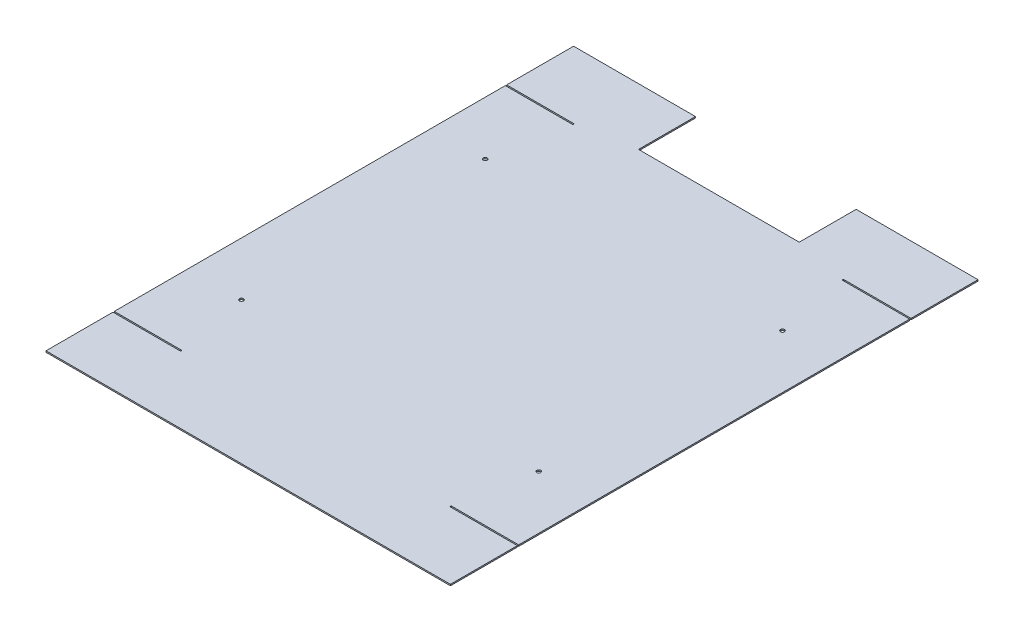
ISO-10303-21;
HEADER;
FILE_DESCRIPTION(('STEP AP214'),'2;1');
FILE_NAME('part.step','',(''),(''),'','','');
FILE_SCHEMA(('AUTOMOTIVE_DESIGN { 1 0 10303 214 1 1 1 1 }'));
ENDSEC;
DATA;
#1=APPLICATION_CONTEXT('core data for automotive mechanical design processes');
#2=APPLICATION_PROTOCOL_DEFINITION('international standard','automotive_design',2000,#1);
#3=PRODUCT_CONTEXT('',#1,'mechanical');
#4=PRODUCT('Part','Part','',(#3));
#5=PRODUCT_RELATED_PRODUCT_CATEGORY('part','',(#4));
#6=PRODUCT_DEFINITION_FORMATION('','',#4);
#7=PRODUCT_DEFINITION_CONTEXT('part definition',#1,'design');
#8=PRODUCT_DEFINITION('design','',#6,#7);
#9=PRODUCT_DEFINITION_SHAPE('','',#8);
#10=(LENGTH_UNIT() NAMED_UNIT(*) SI_UNIT(.MILLI.,.METRE.));
#11=(NAMED_UNIT(*) PLANE_ANGLE_UNIT() SI_UNIT($,.RADIAN.));
#12=(NAMED_UNIT(*) SI_UNIT($,.STERADIAN.) SOLID_ANGLE_UNIT());
#13=UNCERTAINTY_MEASURE_WITH_UNIT(LENGTH_MEASURE(1.E-05),#10,'distance_accuracy_value','');
#14=(GEOMETRIC_REPRESENTATION_CONTEXT(3) GLOBAL_UNCERTAINTY_ASSIGNED_CONTEXT((#13)) GLOBAL_UNIT_ASSIGNED_CONTEXT((#10,
#11,#12)) REPRESENTATION_CONTEXT('',''));
#15=CARTESIAN_POINT('',(0.,0.,0.));
#16=DIRECTION('',(0.,0.,1.));
#17=DIRECTION('',(1.,0.,0.));
#18=AXIS2_PLACEMENT_3D('',#15,#16,#17);
#19=CARTESIAN_POINT('',(-151.,1.,-197.));
#20=DIRECTION('',(0.,0.,1.));
#21=DIRECTION('',(1.,0.,0.));
#22=AXIS2_PLACEMENT_3D('',#19,#20,#21);
#23=PLANE('',#22);
#24=DIRECTION('',(-1.,0.,0.));
#25=VECTOR('',#24,1.);
#26=CARTESIAN_POINT('',(-151.,0.,-197.));
#27=LINE('',#26,#25);
#28=CARTESIAN_POINT('',(151.,0.,-197.));
#29=VERTEX_POINT('',#28);
#30=CARTESIAN_POINT('',(60.,0.,-197.));
#31=VERTEX_POINT('',#30);
#32=EDGE_CURVE('E213',#29,#31,#27,.T.);
#33=ORIENTED_EDGE('',*,*,#32,.T.);
#34=DIRECTION('',(0.,1.,0.));
#35=VECTOR('',#34,1.);
#36=CARTESIAN_POINT('',(60.,0.,-197.));
#37=LINE('',#36,#35);
#38=CARTESIAN_POINT('',(60.,1.,-197.));
#39=VERTEX_POINT('',#38);
#40=EDGE_CURVE('E195',#31,#39,#37,.T.);
#41=ORIENTED_EDGE('',*,*,#40,.T.);
#42=DIRECTION('',(-1.,0.,0.));
#43=VECTOR('',#42,1.);
#44=CARTESIAN_POINT('',(-151.,1.,-197.));
#45=LINE('',#44,#43);
#46=CARTESIAN_POINT('',(151.,1.,-197.));
#47=VERTEX_POINT('',#46);
#48=EDGE_CURVE('E285',#47,#39,#45,.T.);
#49=ORIENTED_EDGE('',*,*,#48,.F.);
#50=DIRECTION('',(0.,-1.,0.));
#51=VECTOR('',#50,1.);
#52=CARTESIAN_POINT('',(151.,1.,-197.));
#53=LINE('',#52,#51);
#54=EDGE_CURVE('E11',#47,#29,#53,.T.);
#55=ORIENTED_EDGE('',*,*,#54,.T.);
#56=EDGE_LOOP('',(#33,#41,#49,#55));
#57=FACE_BOUND('',#56,.T.);
#58=ADVANCED_FACE('F33',(#57),#23,.F.);
#59=CARTESIAN_POINT('',(0.,1.,0.));
#60=DIRECTION('',(0.,1.,0.));
#61=DIRECTION('',(0.,0.,1.));
#62=AXIS2_PLACEMENT_3D('',#59,#60,#61);
#63=PLANE('',#62);
#64=DIRECTION('',(0.,0.,-1.));
#65=VECTOR('',#64,1.);
#66=CARTESIAN_POINT('',(60.,1.,-154.5));
#67=LINE('',#66,#65);
#68=CARTESIAN_POINT('',(60.,1.,-154.5));
#69=VERTEX_POINT('',#68);
#70=EDGE_CURVE('E201',#69,#39,#67,.T.);
#71=ORIENTED_EDGE('',*,*,#70,.F.);
#72=DIRECTION('',(1.,0.,0.));
#73=VECTOR('',#72,1.);
#74=CARTESIAN_POINT('',(-60.,1.,-154.5));
#75=LINE('',#74,#73);
#76=CARTESIAN_POINT('',(-60.,1.,-154.5));
#77=VERTEX_POINT('',#76);
#78=EDGE_CURVE('E215',#77,#69,#75,.T.);
#79=ORIENTED_EDGE('',*,*,#78,.F.);
#80=DIRECTION('',(0.,0.,1.));
#81=VECTOR('',#80,1.);
#82=CARTESIAN_POINT('',(-60.,1.,-154.5));
#83=LINE('',#82,#81);
#84=CARTESIAN_POINT('',(-60.,1.,-197.));
#85=VERTEX_POINT('',#84);
#86=EDGE_CURVE('E365',#85,#77,#83,.T.);
#87=ORIENTED_EDGE('',*,*,#86,.F.);
#88=CARTESIAN_POINT('',(-151.,1.,-197.));
#89=VERTEX_POINT('',#88);
#90=EDGE_CURVE('E283',#85,#89,#45,.T.);
#91=ORIENTED_EDGE('',*,*,#90,.T.);
#92=DIRECTION('',(0.,0.,1.));
#93=VECTOR('',#92,1.);
#94=CARTESIAN_POINT('',(-151.,1.,-197.));
#95=LINE('',#94,#93);
#96=CARTESIAN_POINT('',(-151.,1.,-147.));
#97=VERTEX_POINT('',#96);
#98=EDGE_CURVE('E246',#89,#97,#95,.T.);
#99=ORIENTED_EDGE('',*,*,#98,.T.);
#100=DIRECTION('',(-1.,0.,0.));
#101=VECTOR('',#100,1.);
#102=CARTESIAN_POINT('',(-151.,1.,-147.));
#103=LINE('',#102,#101);
#104=CARTESIAN_POINT('',(-101.,1.,-147.));
#105=VERTEX_POINT('',#104);
#106=EDGE_CURVE('E272',#105,#97,#103,.T.);
#107=ORIENTED_EDGE('',*,*,#106,.F.);
#108=CARTESIAN_POINT('',(-101.,1.,-146.5));
#109=DIRECTION('',(0.,1.,0.));
#110=DIRECTION('',(0.,0.,1.));
#111=AXIS2_PLACEMENT_3D('',#108,#109,#110);
#112=CIRCLE('',#111,0.499999999999973);
#113=CARTESIAN_POINT('',(-101.,1.,-146.));
#114=VERTEX_POINT('',#113);
#115=EDGE_CURVE('E268',#114,#105,#112,.T.);
#116=ORIENTED_EDGE('',*,*,#115,.F.);
#117=DIRECTION('',(1.,0.,0.));
#118=VECTOR('',#117,1.);
#119=CARTESIAN_POINT('',(-151.,1.,-146.));
#120=LINE('',#119,#118);
#121=CARTESIAN_POINT('',(-151.,1.,-146.));
#122=VERTEX_POINT('',#121);
#123=EDGE_CURVE('E265',#122,#114,#120,.T.);
#124=ORIENTED_EDGE('',*,*,#123,.F.);
#125=CARTESIAN_POINT('',(-151.,1.,146.));
#126=VERTEX_POINT('',#125);
#127=EDGE_CURVE('E288',#122,#126,#95,.T.);
#128=ORIENTED_EDGE('',*,*,#127,.T.);
#129=DIRECTION('',(1.,0.,0.));
#130=VECTOR('',#129,1.);
#131=CARTESIAN_POINT('',(-151.,1.,146.));
#132=LINE('',#131,#130);
#133=CARTESIAN_POINT('',(-101.,1.,146.));
#134=VERTEX_POINT('',#133);
#135=EDGE_CURVE('E329',#126,#134,#132,.T.);
#136=ORIENTED_EDGE('',*,*,#135,.T.);
#137=CARTESIAN_POINT('',(-101.,1.,146.5));
#138=DIRECTION('',(0.,-1.,0.));
#139=DIRECTION('',(0.,0.,-1.));
#140=AXIS2_PLACEMENT_3D('',#137,#138,#139);
#141=CIRCLE('',#140,0.499999999999973);
#142=CARTESIAN_POINT('',(-101.,1.,147.));
#143=VERTEX_POINT('',#142);
#144=EDGE_CURVE('E314',#134,#143,#141,.T.);
#145=ORIENTED_EDGE('',*,*,#144,.T.);
#146=DIRECTION('',(-1.,0.,0.));
#147=VECTOR('',#146,1.);
#148=CARTESIAN_POINT('',(-151.,1.,147.));
#149=LINE('',#148,#147);
#150=CARTESIAN_POINT('',(-151.,1.,147.));
#151=VERTEX_POINT('',#150);
#152=EDGE_CURVE('E311',#143,#151,#149,.T.);
#153=ORIENTED_EDGE('',*,*,#152,.T.);
#154=CARTESIAN_POINT('',(-151.,1.,197.));
#155=VERTEX_POINT('',#154);
#156=EDGE_CURVE('E287',#151,#155,#95,.T.);
#157=ORIENTED_EDGE('',*,*,#156,.T.);
#158=DIRECTION('',(1.,0.,0.));
#159=VECTOR('',#158,1.);
#160=CARTESIAN_POINT('',(-151.,1.,197.));
#161=LINE('',#160,#159);
#162=CARTESIAN_POINT('',(151.,1.,197.));
#163=VERTEX_POINT('',#162);
#164=EDGE_CURVE('E236',#155,#163,#161,.T.);
#165=ORIENTED_EDGE('',*,*,#164,.T.);
#166=DIRECTION('',(0.,0.,-1.));
#167=VECTOR('',#166,1.);
#168=CARTESIAN_POINT('',(151.,1.,-197.));
#169=LINE('',#168,#167);
#170=CARTESIAN_POINT('',(151.,1.,147.));
#171=VERTEX_POINT('',#170);
#172=EDGE_CURVE('E280',#163,#171,#169,.T.);
#173=ORIENTED_EDGE('',*,*,#172,.T.);
#174=DIRECTION('',(1.,0.,0.));
#175=VECTOR('',#174,1.);
#176=CARTESIAN_POINT('',(151.,1.,147.));
#177=LINE('',#176,#175);
#178=CARTESIAN_POINT('',(101.,1.,147.));
#179=VERTEX_POINT('',#178);
#180=EDGE_CURVE('E319',#179,#171,#177,.T.);
#181=ORIENTED_EDGE('',*,*,#180,.F.);
#182=CARTESIAN_POINT('',(101.,1.,146.5));
#183=DIRECTION('',(0.,1.,0.));
#184=DIRECTION('',(0.,0.,-1.));
#185=AXIS2_PLACEMENT_3D('',#182,#183,#184);
#186=CIRCLE('',#185,0.499999999999973);
#187=CARTESIAN_POINT('',(101.,1.,146.));
#188=VERTEX_POINT('',#187);
#189=EDGE_CURVE('E429',#188,#179,#186,.T.);
#190=ORIENTED_EDGE('',*,*,#189,.F.);
#191=DIRECTION('',(-1.,0.,0.));
#192=VECTOR('',#191,1.);
#193=CARTESIAN_POINT('',(151.,1.,146.));
#194=LINE('',#193,#192);
#195=CARTESIAN_POINT('',(151.,1.,146.));
#196=VERTEX_POINT('',#195);
#197=EDGE_CURVE('E415',#196,#188,#194,.T.);
#198=ORIENTED_EDGE('',*,*,#197,.F.);
#199=CARTESIAN_POINT('',(151.,1.,-146.));
#200=VERTEX_POINT('',#199);
#201=EDGE_CURVE('E284',#196,#200,#169,.T.);
#202=ORIENTED_EDGE('',*,*,#201,.T.);
#203=DIRECTION('',(-1.,0.,0.));
#204=VECTOR('',#203,1.);
#205=CARTESIAN_POINT('',(151.,1.,-146.));
#206=LINE('',#205,#204);
#207=CARTESIAN_POINT('',(101.,1.,-146.));
#208=VERTEX_POINT('',#207);
#209=EDGE_CURVE('E400',#200,#208,#206,.T.);
#210=ORIENTED_EDGE('',*,*,#209,.T.);
#211=CARTESIAN_POINT('',(101.,1.,-146.5));
#212=DIRECTION('',(0.,-1.,0.));
#213=DIRECTION('',(0.,0.,1.));
#214=AXIS2_PLACEMENT_3D('',#211,#212,#213);
#215=CIRCLE('',#214,0.499999999999973);
#216=CARTESIAN_POINT('',(101.,1.,-147.));
#217=VERTEX_POINT('',#216);
#218=EDGE_CURVE('E407',#208,#217,#215,.T.);
#219=ORIENTED_EDGE('',*,*,#218,.T.);
#220=DIRECTION('',(1.,0.,0.));
#221=VECTOR('',#220,1.);
#222=CARTESIAN_POINT('',(151.,1.,-147.));
#223=LINE('',#222,#221);
#224=CARTESIAN_POINT('',(151.,1.,-147.));
#225=VERTEX_POINT('',#224);
#226=EDGE_CURVE('E395',#217,#225,#223,.T.);
#227=ORIENTED_EDGE('',*,*,#226,.T.);
#228=EDGE_CURVE('E231',#225,#47,#169,.T.);
#229=ORIENTED_EDGE('',*,*,#228,.T.);
#230=ORIENTED_EDGE('',*,*,#48,.T.);
#231=EDGE_LOOP('',(#71,#79,#87,#91,#99,#107,#116,#124,#128,#136,#145,#153,#157,#165,#173,#181,
#190,#198,#202,#210,#219,#227,#229,#230));
#232=FACE_BOUND('',#231,.T.);
#233=CARTESIAN_POINT('',(-111.,1.,91.0000000000001));
#234=DIRECTION('',(0.,-1.,0.));
#235=DIRECTION('',(0.,0.,-1.));
#236=AXIS2_PLACEMENT_3D('',#233,#234,#235);
#237=CIRCLE('',#236,1.5);
#238=CARTESIAN_POINT('',(-111.,1.,89.5000000000001));
#239=VERTEX_POINT('',#238);
#240=EDGE_CURVE('E377',#239,#239,#237,.T.);
#241=ORIENTED_EDGE('',*,*,#240,.T.);
#242=EDGE_LOOP('',(#241));
#243=FACE_BOUND('',#242,.T.);
#244=CARTESIAN_POINT('',(111.,1.,91.0000000000001));
#245=DIRECTION('',(0.,1.,0.));
#246=DIRECTION('',(0.,0.,-1.));
#247=AXIS2_PLACEMENT_3D('',#244,#245,#246);
#248=CIRCLE('',#247,1.5);
#249=CARTESIAN_POINT('',(111.,1.,89.5000000000001));
#250=VERTEX_POINT('',#249);
#251=EDGE_CURVE('E376',#250,#250,#248,.T.);
#252=ORIENTED_EDGE('',*,*,#251,.F.);
#253=EDGE_LOOP('',(#252));
#254=FACE_BOUND('',#253,.T.);
#255=CARTESIAN_POINT('',(111.,1.,-91.0000000000001));
#256=DIRECTION('',(0.,-1.,0.));
#257=DIRECTION('',(0.,0.,1.));
#258=AXIS2_PLACEMENT_3D('',#255,#256,#257);
#259=CIRCLE('',#258,1.5);
#260=CARTESIAN_POINT('',(111.,1.,-89.5000000000001));
#261=VERTEX_POINT('',#260);
#262=EDGE_CURVE('E383',#261,#261,#259,.T.);
#263=ORIENTED_EDGE('',*,*,#262,.T.);
#264=EDGE_LOOP('',(#263));
#265=FACE_BOUND('',#264,.T.);
#266=CARTESIAN_POINT('',(-111.,1.,-91.0000000000001));
#267=DIRECTION('',(0.,1.,0.));
#268=DIRECTION('',(0.,0.,1.));
#269=AXIS2_PLACEMENT_3D('',#266,#267,#268);
#270=CIRCLE('',#269,1.5);
#271=CARTESIAN_POINT('',(-111.,1.,-89.5000000000001));
#272=VERTEX_POINT('',#271);
#273=EDGE_CURVE('E389',#272,#272,#270,.T.);
#274=ORIENTED_EDGE('',*,*,#273,.F.);
#275=EDGE_LOOP('',(#274));
#276=FACE_BOUND('',#275,.T.);
#277=ADVANCED_FACE('F292',(#232,#243,#254,#265,#276),#63,.T.);
#278=CARTESIAN_POINT('',(0.,0.,0.));
#279=DIRECTION('',(0.,1.,0.));
#280=DIRECTION('',(0.,0.,1.));
#281=AXIS2_PLACEMENT_3D('',#278,#279,#280);
#282=PLANE('',#281);
#283=CARTESIAN_POINT('',(-111.,0.,91.0000000000001));
#284=DIRECTION('',(0.,-1.,0.));
#285=DIRECTION('',(0.,0.,-1.));
#286=AXIS2_PLACEMENT_3D('',#283,#284,#285);
#287=CIRCLE('',#286,1.5);
#288=CARTESIAN_POINT('',(-111.,0.,89.5000000000001));
#289=VERTEX_POINT('',#288);
#290=EDGE_CURVE('E373',#289,#289,#287,.T.);
#291=ORIENTED_EDGE('',*,*,#290,.F.);
#292=EDGE_LOOP('',(#291));
#293=FACE_BOUND('',#292,.T.);
#294=CARTESIAN_POINT('',(111.,0.,91.0000000000001));
#295=DIRECTION('',(0.,1.,0.));
#296=DIRECTION('',(0.,0.,-1.));
#297=AXIS2_PLACEMENT_3D('',#294,#295,#296);
#298=CIRCLE('',#297,1.5);
#299=CARTESIAN_POINT('',(111.,0.,89.5000000000001));
#300=VERTEX_POINT('',#299);
#301=EDGE_CURVE('E380',#300,#300,#298,.T.);
#302=ORIENTED_EDGE('',*,*,#301,.T.);
#303=EDGE_LOOP('',(#302));
#304=FACE_BOUND('',#303,.T.);
#305=CARTESIAN_POINT('',(111.,0.,-91.0000000000001));
#306=DIRECTION('',(0.,-1.,0.));
#307=DIRECTION('',(0.,0.,1.));
#308=AXIS2_PLACEMENT_3D('',#305,#306,#307);
#309=CIRCLE('',#308,1.5);
#310=CARTESIAN_POINT('',(111.,0.,-89.5000000000001));
#311=VERTEX_POINT('',#310);
#312=EDGE_CURVE('E386',#311,#311,#309,.T.);
#313=ORIENTED_EDGE('',*,*,#312,.F.);
#314=EDGE_LOOP('',(#313));
#315=FACE_BOUND('',#314,.T.);
#316=CARTESIAN_POINT('',(-111.,0.,-91.0000000000001));
#317=DIRECTION('',(0.,1.,0.));
#318=DIRECTION('',(0.,0.,1.));
#319=AXIS2_PLACEMENT_3D('',#316,#317,#318);
#320=CIRCLE('',#319,1.5);
#321=CARTESIAN_POINT('',(-111.,0.,-89.5000000000001));
#322=VERTEX_POINT('',#321);
#323=EDGE_CURVE('E392',#322,#322,#320,.T.);
#324=ORIENTED_EDGE('',*,*,#323,.T.);
#325=EDGE_LOOP('',(#324));
#326=FACE_BOUND('',#325,.T.);
#327=DIRECTION('',(1.,0.,0.));
#328=VECTOR('',#327,1.);
#329=CARTESIAN_POINT('',(-60.,0.,-154.5));
#330=LINE('',#329,#328);
#331=CARTESIAN_POINT('',(-60.,0.,-154.5));
#332=VERTEX_POINT('',#331);
#333=CARTESIAN_POINT('',(60.,0.,-154.5));
#334=VERTEX_POINT('',#333);
#335=EDGE_CURVE('E207',#332,#334,#330,.T.);
#336=ORIENTED_EDGE('',*,*,#335,.T.);
#337=DIRECTION('',(0.,0.,-1.));
#338=VECTOR('',#337,1.);
#339=CARTESIAN_POINT('',(60.,0.,-154.5));
#340=LINE('',#339,#338);
#341=EDGE_CURVE('E198',#334,#31,#340,.T.);
#342=ORIENTED_EDGE('',*,*,#341,.T.);
#343=ORIENTED_EDGE('',*,*,#32,.F.);
#344=DIRECTION('',(0.,0.,-1.));
#345=VECTOR('',#344,1.);
#346=CARTESIAN_POINT('',(151.,0.,-197.));
#347=LINE('',#346,#345);
#348=CARTESIAN_POINT('',(151.,0.,-147.));
#349=VERTEX_POINT('',#348);
#350=EDGE_CURVE('E276',#349,#29,#347,.T.);
#351=ORIENTED_EDGE('',*,*,#350,.F.);
#352=DIRECTION('',(1.,0.,0.));
#353=VECTOR('',#352,1.);
#354=CARTESIAN_POINT('',(151.,0.,-147.));
#355=LINE('',#354,#353);
#356=CARTESIAN_POINT('',(101.,0.,-147.));
#357=VERTEX_POINT('',#356);
#358=EDGE_CURVE('E56',#357,#349,#355,.T.);
#359=ORIENTED_EDGE('',*,*,#358,.F.);
#360=CARTESIAN_POINT('',(101.,0.,-146.5));
#361=DIRECTION('',(0.,-1.,0.));
#362=DIRECTION('',(0.,0.,1.));
#363=AXIS2_PLACEMENT_3D('',#360,#361,#362);
#364=CIRCLE('',#363,0.499999999999973);
#365=CARTESIAN_POINT('',(101.,0.,-146.));
#366=VERTEX_POINT('',#365);
#367=EDGE_CURVE('E399',#366,#357,#364,.T.);
#368=ORIENTED_EDGE('',*,*,#367,.F.);
#369=DIRECTION('',(-1.,0.,0.));
#370=VECTOR('',#369,1.);
#371=CARTESIAN_POINT('',(151.,0.,-146.));
#372=LINE('',#371,#370);
#373=CARTESIAN_POINT('',(151.,0.,-146.));
#374=VERTEX_POINT('',#373);
#375=EDGE_CURVE('E402',#374,#366,#372,.T.);
#376=ORIENTED_EDGE('',*,*,#375,.F.);
#377=CARTESIAN_POINT('',(151.,0.,146.));
#378=VERTEX_POINT('',#377);
#379=EDGE_CURVE('E446',#378,#374,#347,.T.);
#380=ORIENTED_EDGE('',*,*,#379,.F.);
#381=DIRECTION('',(-1.,0.,0.));
#382=VECTOR('',#381,1.);
#383=CARTESIAN_POINT('',(151.,0.,146.));
#384=LINE('',#383,#382);
#385=CARTESIAN_POINT('',(101.,0.,146.));
#386=VERTEX_POINT('',#385);
#387=EDGE_CURVE('E421',#378,#386,#384,.T.);
#388=ORIENTED_EDGE('',*,*,#387,.T.);
#389=CARTESIAN_POINT('',(101.,0.,146.5));
#390=DIRECTION('',(0.,1.,0.));
#391=DIRECTION('',(0.,0.,-1.));
#392=AXIS2_PLACEMENT_3D('',#389,#390,#391);
#393=CIRCLE('',#392,0.499999999999973);
#394=CARTESIAN_POINT('',(101.,0.,147.));
#395=VERTEX_POINT('',#394);
#396=EDGE_CURVE('E424',#386,#395,#393,.T.);
#397=ORIENTED_EDGE('',*,*,#396,.T.);
#398=DIRECTION('',(1.,0.,0.));
#399=VECTOR('',#398,1.);
#400=CARTESIAN_POINT('',(151.,0.,147.));
#401=LINE('',#400,#399);
#402=CARTESIAN_POINT('',(151.,0.,147.));
#403=VERTEX_POINT('',#402);
#404=EDGE_CURVE('E325',#395,#403,#401,.T.);
#405=ORIENTED_EDGE('',*,*,#404,.T.);
#406=CARTESIAN_POINT('',(151.,0.,197.));
#407=VERTEX_POINT('',#406);
#408=EDGE_CURVE('E224',#407,#403,#347,.T.);
#409=ORIENTED_EDGE('',*,*,#408,.F.);
#410=DIRECTION('',(1.,0.,0.));
#411=VECTOR('',#410,1.);
#412=CARTESIAN_POINT('',(-151.,0.,197.));
#413=LINE('',#412,#411);
#414=CARTESIAN_POINT('',(-151.,0.,197.));
#415=VERTEX_POINT('',#414);
#416=EDGE_CURVE('E229',#415,#407,#413,.T.);
#417=ORIENTED_EDGE('',*,*,#416,.F.);
#418=DIRECTION('',(0.,0.,1.));
#419=VECTOR('',#418,1.);
#420=CARTESIAN_POINT('',(-151.,0.,-197.));
#421=LINE('',#420,#419);
#422=CARTESIAN_POINT('',(-151.,0.,147.));
#423=VERTEX_POINT('',#422);
#424=EDGE_CURVE('E218',#423,#415,#421,.T.);
#425=ORIENTED_EDGE('',*,*,#424,.F.);
#426=DIRECTION('',(-1.,0.,0.));
#427=VECTOR('',#426,1.);
#428=CARTESIAN_POINT('',(-151.,0.,147.));
#429=LINE('',#428,#427);
#430=CARTESIAN_POINT('',(-101.,0.,147.));
#431=VERTEX_POINT('',#430);
#432=EDGE_CURVE('E326',#431,#423,#429,.T.);
#433=ORIENTED_EDGE('',*,*,#432,.F.);
#434=CARTESIAN_POINT('',(-101.,0.,146.5));
#435=DIRECTION('',(0.,-1.,0.));
#436=DIRECTION('',(0.,0.,-1.));
#437=AXIS2_PLACEMENT_3D('',#434,#435,#436);
#438=CIRCLE('',#437,0.499999999999973);
#439=CARTESIAN_POINT('',(-101.,0.,146.));
#440=VERTEX_POINT('',#439);
#441=EDGE_CURVE('E328',#440,#431,#438,.T.);
#442=ORIENTED_EDGE('',*,*,#441,.F.);
#443=DIRECTION('',(1.,0.,0.));
#444=VECTOR('',#443,1.);
#445=CARTESIAN_POINT('',(-151.,0.,146.));
#446=LINE('',#445,#444);
#447=CARTESIAN_POINT('',(-151.,0.,146.));
#448=VERTEX_POINT('',#447);
#449=EDGE_CURVE('E332',#448,#440,#446,.T.);
#450=ORIENTED_EDGE('',*,*,#449,.F.);
#451=CARTESIAN_POINT('',(-151.,0.,-146.));
#452=VERTEX_POINT('',#451);
#453=EDGE_CURVE('E221',#452,#448,#421,.T.);
#454=ORIENTED_EDGE('',*,*,#453,.F.);
#455=DIRECTION('',(1.,0.,0.));
#456=VECTOR('',#455,1.);
#457=CARTESIAN_POINT('',(-151.,0.,-146.));
#458=LINE('',#457,#456);
#459=CARTESIAN_POINT('',(-101.,0.,-146.));
#460=VERTEX_POINT('',#459);
#461=EDGE_CURVE('E261',#452,#460,#458,.T.);
#462=ORIENTED_EDGE('',*,*,#461,.T.);
#463=CARTESIAN_POINT('',(-101.,0.,-146.5));
#464=DIRECTION('',(0.,1.,0.));
#465=DIRECTION('',(0.,0.,1.));
#466=AXIS2_PLACEMENT_3D('',#463,#464,#465);
#467=CIRCLE('',#466,0.499999999999973);
#468=CARTESIAN_POINT('',(-101.,0.,-147.));
#469=VERTEX_POINT('',#468);
#470=EDGE_CURVE('E255',#460,#469,#467,.T.);
#471=ORIENTED_EDGE('',*,*,#470,.T.);
#472=DIRECTION('',(-1.,0.,0.));
#473=VECTOR('',#472,1.);
#474=CARTESIAN_POINT('',(-151.,0.,-147.));
#475=LINE('',#474,#473);
#476=CARTESIAN_POINT('',(-151.,0.,-147.));
#477=VERTEX_POINT('',#476);
#478=EDGE_CURVE('E253',#469,#477,#475,.T.);
#479=ORIENTED_EDGE('',*,*,#478,.T.);
#480=CARTESIAN_POINT('',(-151.,0.,-197.));
#481=VERTEX_POINT('',#480);
#482=EDGE_CURVE('E223',#481,#477,#421,.T.);
#483=ORIENTED_EDGE('',*,*,#482,.F.);
#484=CARTESIAN_POINT('',(-59.9999999999999,0.,-197.));
#485=VERTEX_POINT('',#484);
#486=EDGE_CURVE('E219',#485,#481,#27,.T.);
#487=ORIENTED_EDGE('',*,*,#486,.F.);
#488=DIRECTION('',(0.,0.,1.));
#489=VECTOR('',#488,1.);
#490=CARTESIAN_POINT('',(-60.,0.,-154.5));
#491=LINE('',#490,#489);
#492=EDGE_CURVE('E48',#485,#332,#491,.T.);
#493=ORIENTED_EDGE('',*,*,#492,.T.);
#494=EDGE_LOOP('',(#336,#342,#343,#351,#359,#368,#376,#380,#388,#397,#405,#409,#417,#425,#433,
#442,#450,#454,#462,#471,#479,#483,#487,#493));
#495=FACE_BOUND('',#494,.T.);
#496=ADVANCED_FACE('F211',(#293,#304,#315,#326,#495),#282,.F.);
#497=CARTESIAN_POINT('',(151.,1.,-197.));
#498=DIRECTION('',(-1.,0.,0.));
#499=DIRECTION('',(0.,0.,1.));
#500=AXIS2_PLACEMENT_3D('',#497,#498,#499);
#501=PLANE('',#500);
#502=DIRECTION('',(0.,1.,0.));
#503=VECTOR('',#502,1.);
#504=CARTESIAN_POINT('',(151.,0.,-146.));
#505=LINE('',#504,#503);
#506=EDGE_CURVE('E412',#374,#200,#505,.T.);
#507=ORIENTED_EDGE('',*,*,#506,.T.);
#508=ORIENTED_EDGE('',*,*,#201,.F.);
#509=DIRECTION('',(0.,1.,0.));
#510=VECTOR('',#509,1.);
#511=CARTESIAN_POINT('',(151.,0.,146.));
#512=LINE('',#511,#510);
#513=EDGE_CURVE('E323',#378,#196,#512,.T.);
#514=ORIENTED_EDGE('',*,*,#513,.F.);
#515=ORIENTED_EDGE('',*,*,#379,.T.);
#516=EDGE_LOOP('',(#507,#508,#514,#515));
#517=FACE_BOUND('',#516,.T.);
#518=ADVANCED_FACE('F35',(#517),#501,.F.);
#519=DIRECTION('',(0.,1.,0.));
#520=VECTOR('',#519,1.);
#521=CARTESIAN_POINT('',(151.,0.,-147.));
#522=LINE('',#521,#520);
#523=EDGE_CURVE('E404',#349,#225,#522,.T.);
#524=ORIENTED_EDGE('',*,*,#523,.F.);
#525=ORIENTED_EDGE('',*,*,#350,.T.);
#526=ORIENTED_EDGE('',*,*,#54,.F.);
#527=ORIENTED_EDGE('',*,*,#228,.F.);
#528=EDGE_LOOP('',(#524,#525,#526,#527));
#529=FACE_BOUND('',#528,.T.);
#530=ADVANCED_FACE('F445',(#529),#501,.F.);
#531=ORIENTED_EDGE('',*,*,#408,.T.);
#532=DIRECTION('',(0.,1.,0.));
#533=VECTOR('',#532,1.);
#534=CARTESIAN_POINT('',(151.,0.,147.));
#535=LINE('',#534,#533);
#536=EDGE_CURVE('E307',#403,#171,#535,.T.);
#537=ORIENTED_EDGE('',*,*,#536,.T.);
#538=ORIENTED_EDGE('',*,*,#172,.F.);
#539=DIRECTION('',(0.,-1.,0.));
#540=VECTOR('',#539,1.);
#541=CARTESIAN_POINT('',(151.,1.,197.));
#542=LINE('',#541,#540);
#543=EDGE_CURVE('E232',#163,#407,#542,.T.);
#544=ORIENTED_EDGE('',*,*,#543,.T.);
#545=EDGE_LOOP('',(#531,#537,#538,#544));
#546=FACE_BOUND('',#545,.T.);
#547=ADVANCED_FACE('F306',(#546),#501,.F.);
#548=CARTESIAN_POINT('',(-151.,1.,-197.));
#549=DIRECTION('',(1.,0.,0.));
#550=DIRECTION('',(0.,0.,-1.));
#551=AXIS2_PLACEMENT_3D('',#548,#549,#550);
#552=PLANE('',#551);
#553=DIRECTION('',(0.,1.,0.));
#554=VECTOR('',#553,1.);
#555=CARTESIAN_POINT('',(-151.,0.,146.));
#556=LINE('',#555,#554);
#557=EDGE_CURVE('E269',#448,#126,#556,.T.);
#558=ORIENTED_EDGE('',*,*,#557,.T.);
#559=ORIENTED_EDGE('',*,*,#127,.F.);
#560=DIRECTION('',(0.,1.,0.));
#561=VECTOR('',#560,1.);
#562=CARTESIAN_POINT('',(-151.,0.,-146.));
#563=LINE('',#562,#561);
#564=EDGE_CURVE('E257',#452,#122,#563,.T.);
#565=ORIENTED_EDGE('',*,*,#564,.F.);
#566=ORIENTED_EDGE('',*,*,#453,.T.);
#567=EDGE_LOOP('',(#558,#559,#565,#566));
#568=FACE_BOUND('',#567,.T.);
#569=ADVANCED_FACE('F355',(#568),#552,.F.);
#570=DIRECTION('',(0.,1.,0.));
#571=VECTOR('',#570,1.);
#572=CARTESIAN_POINT('',(-151.,0.,147.));
#573=LINE('',#572,#571);
#574=EDGE_CURVE('E333',#423,#151,#573,.T.);
#575=ORIENTED_EDGE('',*,*,#574,.F.);
#576=ORIENTED_EDGE('',*,*,#424,.T.);
#577=DIRECTION('',(0.,-1.,0.));
#578=VECTOR('',#577,1.);
#579=CARTESIAN_POINT('',(-151.,1.,197.));
#580=LINE('',#579,#578);
#581=EDGE_CURVE('E235',#155,#415,#580,.T.);
#582=ORIENTED_EDGE('',*,*,#581,.F.);
#583=ORIENTED_EDGE('',*,*,#156,.F.);
#584=EDGE_LOOP('',(#575,#576,#582,#583));
#585=FACE_BOUND('',#584,.T.);
#586=ADVANCED_FACE('F480',(#585),#552,.F.);
#587=ORIENTED_EDGE('',*,*,#482,.T.);
#588=DIRECTION('',(0.,1.,0.));
#589=VECTOR('',#588,1.);
#590=CARTESIAN_POINT('',(-151.,0.,-147.));
#591=LINE('',#590,#589);
#592=EDGE_CURVE('E274',#477,#97,#591,.T.);
#593=ORIENTED_EDGE('',*,*,#592,.T.);
#594=ORIENTED_EDGE('',*,*,#98,.F.);
#595=DIRECTION('',(0.,-1.,0.));
#596=VECTOR('',#595,1.);
#597=CARTESIAN_POINT('',(-151.,1.,-197.));
#598=LINE('',#597,#596);
#599=EDGE_CURVE('E41',#89,#481,#598,.T.);
#600=ORIENTED_EDGE('',*,*,#599,.T.);
#601=EDGE_LOOP('',(#587,#593,#594,#600));
#602=FACE_BOUND('',#601,.T.);
#603=ADVANCED_FACE('F243',(#602),#552,.F.);
#604=ORIENTED_EDGE('',*,*,#90,.F.);
#605=DIRECTION('',(0.,1.,0.));
#606=VECTOR('',#605,1.);
#607=CARTESIAN_POINT('',(-60.,0.,-197.));
#608=LINE('',#607,#606);
#609=EDGE_CURVE('E206',#485,#85,#608,.T.);
#610=ORIENTED_EDGE('',*,*,#609,.F.);
#611=ORIENTED_EDGE('',*,*,#486,.T.);
#612=ORIENTED_EDGE('',*,*,#599,.F.);
#613=EDGE_LOOP('',(#604,#610,#611,#612));
#614=FACE_BOUND('',#613,.T.);
#615=ADVANCED_FACE('F366',(#614),#23,.F.);
#616=CARTESIAN_POINT('',(-151.,1.,197.));
#617=DIRECTION('',(0.,0.,-1.));
#618=DIRECTION('',(-1.,0.,0.));
#619=AXIS2_PLACEMENT_3D('',#616,#617,#618);
#620=PLANE('',#619);
#621=ORIENTED_EDGE('',*,*,#416,.T.);
#622=ORIENTED_EDGE('',*,*,#543,.F.);
#623=ORIENTED_EDGE('',*,*,#164,.F.);
#624=ORIENTED_EDGE('',*,*,#581,.T.);
#625=EDGE_LOOP('',(#621,#622,#623,#624));
#626=FACE_BOUND('',#625,.T.);
#627=ADVANCED_FACE('F300',(#626),#620,.F.);
#628=CARTESIAN_POINT('',(-151.,0.,-147.));
#629=DIRECTION('',(0.,0.,-1.));
#630=DIRECTION('',(-1.,0.,0.));
#631=AXIS2_PLACEMENT_3D('',#628,#629,#630);
#632=PLANE('',#631);
#633=ORIENTED_EDGE('',*,*,#106,.T.);
#634=ORIENTED_EDGE('',*,*,#592,.F.);
#635=ORIENTED_EDGE('',*,*,#478,.F.);
#636=DIRECTION('',(0.,1.,0.));
#637=VECTOR('',#636,1.);
#638=CARTESIAN_POINT('',(-101.,0.,-147.));
#639=LINE('',#638,#637);
#640=EDGE_CURVE('E277',#469,#105,#639,.T.);
#641=ORIENTED_EDGE('',*,*,#640,.T.);
#642=EDGE_LOOP('',(#633,#634,#635,#641));
#643=FACE_BOUND('',#642,.T.);
#644=ADVANCED_FACE('F361',(#643),#632,.F.);
#645=CARTESIAN_POINT('',(-101.,0.,-146.5));
#646=DIRECTION('',(0.,1.,0.));
#647=DIRECTION('',(0.,0.,1.));
#648=AXIS2_PLACEMENT_3D('',#645,#646,#647);
#649=CYLINDRICAL_SURFACE('',#648,0.499999999999973);
#650=ORIENTED_EDGE('',*,*,#115,.T.);
#651=ORIENTED_EDGE('',*,*,#640,.F.);
#652=ORIENTED_EDGE('',*,*,#470,.F.);
#653=DIRECTION('',(0.,1.,0.));
#654=VECTOR('',#653,1.);
#655=CARTESIAN_POINT('',(-101.,0.,-146.));
#656=LINE('',#655,#654);
#657=EDGE_CURVE('E259',#460,#114,#656,.T.);
#658=ORIENTED_EDGE('',*,*,#657,.T.);
#659=EDGE_LOOP('',(#650,#651,#652,#658));
#660=FACE_BOUND('',#659,.T.);
#661=ADVANCED_FACE('F360',(#660),#649,.F.);
#662=CARTESIAN_POINT('',(-151.,0.,-146.));
#663=DIRECTION('',(0.,0.,1.));
#664=DIRECTION('',(1.,0.,0.));
#665=AXIS2_PLACEMENT_3D('',#662,#663,#664);
#666=PLANE('',#665);
#667=ORIENTED_EDGE('',*,*,#123,.T.);
#668=ORIENTED_EDGE('',*,*,#657,.F.);
#669=ORIENTED_EDGE('',*,*,#461,.F.);
#670=ORIENTED_EDGE('',*,*,#564,.T.);
#671=EDGE_LOOP('',(#667,#668,#669,#670));
#672=FACE_BOUND('',#671,.T.);
#673=ADVANCED_FACE('F351',(#672),#666,.F.);
#674=CARTESIAN_POINT('',(-151.,0.,146.));
#675=DIRECTION('',(0.,0.,1.));
#676=DIRECTION('',(1.,0.,0.));
#677=AXIS2_PLACEMENT_3D('',#674,#675,#676);
#678=PLANE('',#677);
#679=ORIENTED_EDGE('',*,*,#135,.F.);
#680=ORIENTED_EDGE('',*,*,#557,.F.);
#681=ORIENTED_EDGE('',*,*,#449,.T.);
#682=DIRECTION('',(0.,1.,0.));
#683=VECTOR('',#682,1.);
#684=CARTESIAN_POINT('',(-101.,0.,146.));
#685=LINE('',#684,#683);
#686=EDGE_CURVE('E341',#440,#134,#685,.T.);
#687=ORIENTED_EDGE('',*,*,#686,.T.);
#688=EDGE_LOOP('',(#679,#680,#681,#687));
#689=FACE_BOUND('',#688,.T.);
#690=ADVANCED_FACE('F505',(#689),#678,.T.);
#691=CARTESIAN_POINT('',(-101.,0.,146.5));
#692=DIRECTION('',(0.,1.,0.));
#693=DIRECTION('',(0.,0.,1.));
#694=AXIS2_PLACEMENT_3D('',#691,#692,#693);
#695=CYLINDRICAL_SURFACE('',#694,0.499999999999973);
#696=ORIENTED_EDGE('',*,*,#144,.F.);
#697=ORIENTED_EDGE('',*,*,#686,.F.);
#698=ORIENTED_EDGE('',*,*,#441,.T.);
#699=DIRECTION('',(0.,1.,0.));
#700=VECTOR('',#699,1.);
#701=CARTESIAN_POINT('',(-101.,0.,147.));
#702=LINE('',#701,#700);
#703=EDGE_CURVE('E343',#431,#143,#702,.T.);
#704=ORIENTED_EDGE('',*,*,#703,.T.);
#705=EDGE_LOOP('',(#696,#697,#698,#704));
#706=FACE_BOUND('',#705,.T.);
#707=ADVANCED_FACE('F513',(#706),#695,.F.);
#708=CARTESIAN_POINT('',(-151.,0.,147.));
#709=DIRECTION('',(0.,0.,-1.));
#710=DIRECTION('',(-1.,0.,0.));
#711=AXIS2_PLACEMENT_3D('',#708,#709,#710);
#712=PLANE('',#711);
#713=ORIENTED_EDGE('',*,*,#152,.F.);
#714=ORIENTED_EDGE('',*,*,#703,.F.);
#715=ORIENTED_EDGE('',*,*,#432,.T.);
#716=ORIENTED_EDGE('',*,*,#574,.T.);
#717=EDGE_LOOP('',(#713,#714,#715,#716));
#718=FACE_BOUND('',#717,.T.);
#719=ADVANCED_FACE('F510',(#718),#712,.T.);
#720=CARTESIAN_POINT('',(151.,0.,147.));
#721=DIRECTION('',(0.,0.,1.));
#722=DIRECTION('',(1.,0.,0.));
#723=AXIS2_PLACEMENT_3D('',#720,#721,#722);
#724=PLANE('',#723);
#725=ORIENTED_EDGE('',*,*,#180,.T.);
#726=ORIENTED_EDGE('',*,*,#536,.F.);
#727=ORIENTED_EDGE('',*,*,#404,.F.);
#728=DIRECTION('',(0.,1.,0.));
#729=VECTOR('',#728,1.);
#730=CARTESIAN_POINT('',(101.,0.,147.));
#731=LINE('',#730,#729);
#732=EDGE_CURVE('E312',#395,#179,#731,.T.);
#733=ORIENTED_EDGE('',*,*,#732,.T.);
#734=EDGE_LOOP('',(#725,#726,#727,#733));
#735=FACE_BOUND('',#734,.T.);
#736=ADVANCED_FACE('F433',(#735),#724,.F.);
#737=CARTESIAN_POINT('',(101.,0.,146.5));
#738=DIRECTION('',(0.,1.,0.));
#739=DIRECTION('',(0.,0.,1.));
#740=AXIS2_PLACEMENT_3D('',#737,#738,#739);
#741=CYLINDRICAL_SURFACE('',#740,0.499999999999973);
#742=ORIENTED_EDGE('',*,*,#189,.T.);
#743=ORIENTED_EDGE('',*,*,#732,.F.);
#744=ORIENTED_EDGE('',*,*,#396,.F.);
#745=DIRECTION('',(0.,1.,0.));
#746=VECTOR('',#745,1.);
#747=CARTESIAN_POINT('',(101.,0.,146.));
#748=LINE('',#747,#746);
#749=EDGE_CURVE('E316',#386,#188,#748,.T.);
#750=ORIENTED_EDGE('',*,*,#749,.T.);
#751=EDGE_LOOP('',(#742,#743,#744,#750));
#752=FACE_BOUND('',#751,.T.);
#753=ADVANCED_FACE('F524',(#752),#741,.F.);
#754=CARTESIAN_POINT('',(151.,0.,146.));
#755=DIRECTION('',(0.,0.,-1.));
#756=DIRECTION('',(-1.,0.,0.));
#757=AXIS2_PLACEMENT_3D('',#754,#755,#756);
#758=PLANE('',#757);
#759=ORIENTED_EDGE('',*,*,#197,.T.);
#760=ORIENTED_EDGE('',*,*,#749,.F.);
#761=ORIENTED_EDGE('',*,*,#387,.F.);
#762=ORIENTED_EDGE('',*,*,#513,.T.);
#763=EDGE_LOOP('',(#759,#760,#761,#762));
#764=FACE_BOUND('',#763,.T.);
#765=ADVANCED_FACE('F521',(#764),#758,.F.);
#766=CARTESIAN_POINT('',(151.,0.,-146.));
#767=DIRECTION('',(0.,0.,-1.));
#768=DIRECTION('',(-1.,0.,0.));
#769=AXIS2_PLACEMENT_3D('',#766,#767,#768);
#770=PLANE('',#769);
#771=ORIENTED_EDGE('',*,*,#209,.F.);
#772=ORIENTED_EDGE('',*,*,#506,.F.);
#773=ORIENTED_EDGE('',*,*,#375,.T.);
#774=DIRECTION('',(0.,1.,0.));
#775=VECTOR('',#774,1.);
#776=CARTESIAN_POINT('',(101.,0.,-146.));
#777=LINE('',#776,#775);
#778=EDGE_CURVE('E416',#366,#208,#777,.T.);
#779=ORIENTED_EDGE('',*,*,#778,.T.);
#780=EDGE_LOOP('',(#771,#772,#773,#779));
#781=FACE_BOUND('',#780,.T.);
#782=ADVANCED_FACE('F451',(#781),#770,.T.);
#783=CARTESIAN_POINT('',(101.,0.,-146.5));
#784=DIRECTION('',(0.,1.,0.));
#785=DIRECTION('',(0.,0.,1.));
#786=AXIS2_PLACEMENT_3D('',#783,#784,#785);
#787=CYLINDRICAL_SURFACE('',#786,0.499999999999973);
#788=ORIENTED_EDGE('',*,*,#218,.F.);
#789=ORIENTED_EDGE('',*,*,#778,.F.);
#790=ORIENTED_EDGE('',*,*,#367,.T.);
#791=DIRECTION('',(0.,1.,0.));
#792=VECTOR('',#791,1.);
#793=CARTESIAN_POINT('',(101.,0.,-147.));
#794=LINE('',#793,#792);
#795=EDGE_CURVE('E418',#357,#217,#794,.T.);
#796=ORIENTED_EDGE('',*,*,#795,.T.);
#797=EDGE_LOOP('',(#788,#789,#790,#796));
#798=FACE_BOUND('',#797,.T.);
#799=ADVANCED_FACE('F454',(#798),#787,.F.);
#800=CARTESIAN_POINT('',(151.,0.,-147.));
#801=DIRECTION('',(0.,0.,1.));
#802=DIRECTION('',(1.,0.,0.));
#803=AXIS2_PLACEMENT_3D('',#800,#801,#802);
#804=PLANE('',#803);
#805=ORIENTED_EDGE('',*,*,#226,.F.);
#806=ORIENTED_EDGE('',*,*,#795,.F.);
#807=ORIENTED_EDGE('',*,*,#358,.T.);
#808=ORIENTED_EDGE('',*,*,#523,.T.);
#809=EDGE_LOOP('',(#805,#806,#807,#808));
#810=FACE_BOUND('',#809,.T.);
#811=ADVANCED_FACE('F455',(#810),#804,.T.);
#812=CARTESIAN_POINT('',(-111.,0.,-91.0000000000001));
#813=DIRECTION('',(0.,1.,0.));
#814=DIRECTION('',(0.,0.,1.));
#815=AXIS2_PLACEMENT_3D('',#812,#813,#814);
#816=CYLINDRICAL_SURFACE('',#815,1.5);
#817=ORIENTED_EDGE('',*,*,#323,.F.);
#818=EDGE_LOOP('',(#817));
#819=FACE_BOUND('',#818,.T.);
#820=ORIENTED_EDGE('',*,*,#273,.T.);
#821=EDGE_LOOP('',(#820));
#822=FACE_BOUND('',#821,.T.);
#823=ADVANCED_FACE('F457',(#819,#822),#816,.F.);
#824=CARTESIAN_POINT('',(111.,0.,-91.0000000000001));
#825=DIRECTION('',(0.,1.,0.));
#826=DIRECTION('',(0.,0.,1.));
#827=AXIS2_PLACEMENT_3D('',#824,#825,#826);
#828=CYLINDRICAL_SURFACE('',#827,1.5);
#829=ORIENTED_EDGE('',*,*,#312,.T.);
#830=EDGE_LOOP('',(#829));
#831=FACE_BOUND('',#830,.T.);
#832=ORIENTED_EDGE('',*,*,#262,.F.);
#833=EDGE_LOOP('',(#832));
#834=FACE_BOUND('',#833,.T.);
#835=ADVANCED_FACE('F463',(#831,#834),#828,.F.);
#836=CARTESIAN_POINT('',(111.,0.,91.0000000000001));
#837=DIRECTION('',(0.,1.,0.));
#838=DIRECTION('',(0.,0.,1.));
#839=AXIS2_PLACEMENT_3D('',#836,#837,#838);
#840=CYLINDRICAL_SURFACE('',#839,1.5);
#841=ORIENTED_EDGE('',*,*,#301,.F.);
#842=EDGE_LOOP('',(#841));
#843=FACE_BOUND('',#842,.T.);
#844=ORIENTED_EDGE('',*,*,#251,.T.);
#845=EDGE_LOOP('',(#844));
#846=FACE_BOUND('',#845,.T.);
#847=ADVANCED_FACE('F568',(#843,#846),#840,.F.);
#848=CARTESIAN_POINT('',(-111.,0.,91.0000000000001));
#849=DIRECTION('',(0.,1.,0.));
#850=DIRECTION('',(0.,0.,1.));
#851=AXIS2_PLACEMENT_3D('',#848,#849,#850);
#852=CYLINDRICAL_SURFACE('',#851,1.5);
#853=ORIENTED_EDGE('',*,*,#290,.T.);
#854=EDGE_LOOP('',(#853));
#855=FACE_BOUND('',#854,.T.);
#856=ORIENTED_EDGE('',*,*,#240,.F.);
#857=EDGE_LOOP('',(#856));
#858=FACE_BOUND('',#857,.T.);
#859=ADVANCED_FACE('F578',(#855,#858),#852,.F.);
#860=CARTESIAN_POINT('',(60.,0.,-154.5));
#861=DIRECTION('',(1.,0.,0.));
#862=DIRECTION('',(0.,0.,-1.));
#863=AXIS2_PLACEMENT_3D('',#860,#861,#862);
#864=PLANE('',#863);
#865=ORIENTED_EDGE('',*,*,#70,.T.);
#866=ORIENTED_EDGE('',*,*,#40,.F.);
#867=ORIENTED_EDGE('',*,*,#341,.F.);
#868=DIRECTION('',(0.,1.,0.));
#869=VECTOR('',#868,1.);
#870=CARTESIAN_POINT('',(60.,0.,-154.5));
#871=LINE('',#870,#869);
#872=EDGE_CURVE('E369',#334,#69,#871,.T.);
#873=ORIENTED_EDGE('',*,*,#872,.T.);
#874=EDGE_LOOP('',(#865,#866,#867,#873));
#875=FACE_BOUND('',#874,.T.);
#876=ADVANCED_FACE('F197',(#875),#864,.F.);
#877=CARTESIAN_POINT('',(-60.,0.,-154.5));
#878=DIRECTION('',(0.,0.,1.));
#879=DIRECTION('',(1.,0.,0.));
#880=AXIS2_PLACEMENT_3D('',#877,#878,#879);
#881=PLANE('',#880);
#882=ORIENTED_EDGE('',*,*,#78,.T.);
#883=ORIENTED_EDGE('',*,*,#872,.F.);
#884=ORIENTED_EDGE('',*,*,#335,.F.);
#885=DIRECTION('',(0.,1.,0.));
#886=VECTOR('',#885,1.);
#887=CARTESIAN_POINT('',(-60.,0.,-154.5));
#888=LINE('',#887,#886);
#889=EDGE_CURVE('E367',#332,#77,#888,.T.);
#890=ORIENTED_EDGE('',*,*,#889,.T.);
#891=EDGE_LOOP('',(#882,#883,#884,#890));
#892=FACE_BOUND('',#891,.T.);
#893=ADVANCED_FACE('F617',(#892),#881,.F.);
#894=CARTESIAN_POINT('',(-60.,0.,-154.5));
#895=DIRECTION('',(-1.,0.,0.));
#896=DIRECTION('',(0.,0.,1.));
#897=AXIS2_PLACEMENT_3D('',#894,#895,#896);
#898=PLANE('',#897);
#899=ORIENTED_EDGE('',*,*,#86,.T.);
#900=ORIENTED_EDGE('',*,*,#889,.F.);
#901=ORIENTED_EDGE('',*,*,#492,.F.);
#902=ORIENTED_EDGE('',*,*,#609,.T.);
#903=EDGE_LOOP('',(#899,#900,#901,#902));
#904=FACE_BOUND('',#903,.T.);
#905=ADVANCED_FACE('F626',(#904),#898,.F.);
#906=CLOSED_SHELL('',(#58,#277,#496,#518,#530,#547,#569,#586,#603,#615,#627,#644,#661,#673,#690,
#707,#719,#736,#753,#765,#782,#799,#811,#823,#835,#847,#859,#876,#893,#905));
#907=MANIFOLD_SOLID_BREP('B2',#906);
#908=ADVANCED_BREP_SHAPE_REPRESENTATION('',(#18,#907),#14);
#909=SHAPE_DEFINITION_REPRESENTATION(#9,#908);
ENDSEC;
END-ISO-10303-21;
